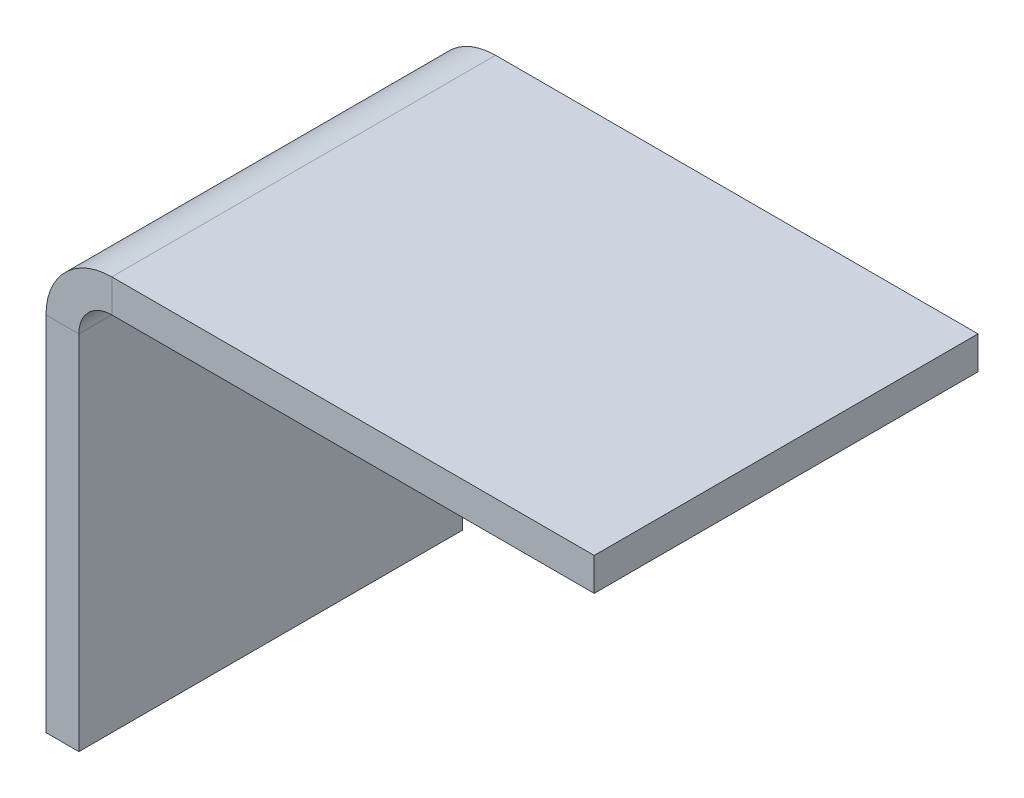
ISO-10303-21;
HEADER;
FILE_DESCRIPTION(('STEP AP214'),'2;1');
FILE_NAME('part.step','',(''),(''),'','','');
FILE_SCHEMA(('AUTOMOTIVE_DESIGN { 1 0 10303 214 1 1 1 1 }'));
ENDSEC;
DATA;
#1=APPLICATION_CONTEXT('core data for automotive mechanical design processes');
#2=APPLICATION_PROTOCOL_DEFINITION('international standard','automotive_design',2000,#1);
#3=PRODUCT_CONTEXT('',#1,'mechanical');
#4=PRODUCT('Part','Part','',(#3));
#5=PRODUCT_RELATED_PRODUCT_CATEGORY('part','',(#4));
#6=PRODUCT_DEFINITION_FORMATION('','',#4);
#7=PRODUCT_DEFINITION_CONTEXT('part definition',#1,'design');
#8=PRODUCT_DEFINITION('design','',#6,#7);
#9=PRODUCT_DEFINITION_SHAPE('','',#8);
#10=(LENGTH_UNIT() NAMED_UNIT(*) SI_UNIT(.MILLI.,.METRE.));
#11=(NAMED_UNIT(*) PLANE_ANGLE_UNIT() SI_UNIT($,.RADIAN.));
#12=(NAMED_UNIT(*) SI_UNIT($,.STERADIAN.) SOLID_ANGLE_UNIT());
#13=UNCERTAINTY_MEASURE_WITH_UNIT(LENGTH_MEASURE(1.E-05),#10,'distance_accuracy_value','');
#14=(GEOMETRIC_REPRESENTATION_CONTEXT(3) GLOBAL_UNCERTAINTY_ASSIGNED_CONTEXT((#13)) GLOBAL_UNIT_ASSIGNED_CONTEXT((#10,
#11,#12)) REPRESENTATION_CONTEXT('',''));
#15=CARTESIAN_POINT('',(0.,0.,0.));
#16=DIRECTION('',(0.,0.,1.));
#17=DIRECTION('',(1.,0.,0.));
#18=AXIS2_PLACEMENT_3D('',#15,#16,#17);
#19=CARTESIAN_POINT('',(-3.,342.335120643432,1731.23324396783));
#20=DIRECTION('',(0.,0.,1.));
#21=DIRECTION('',(1.,0.,0.));
#22=AXIS2_PLACEMENT_3D('',#19,#20,#21);
#23=PLANE('',#22);
#24=DIRECTION('',(0.,-1.,0.));
#25=VECTOR('',#24,1.);
#26=CARTESIAN_POINT('',(0.,342.335120643432,1731.23324396783));
#27=LINE('',#26,#25);
#28=CARTESIAN_POINT('',(0.,375.335120643432,1731.23324396783));
#29=VERTEX_POINT('',#28);
#30=CARTESIAN_POINT('',(0.,342.335120643432,1731.23324396783));
#31=VERTEX_POINT('',#30);
#32=EDGE_CURVE('E93',#29,#31,#27,.T.);
#33=ORIENTED_EDGE('',*,*,#32,.F.);
#34=DIRECTION('',(1.,0.,0.));
#35=VECTOR('',#34,1.);
#36=CARTESIAN_POINT('',(-3.,375.335120643432,1731.23324396783));
#37=LINE('',#36,#35);
#38=CARTESIAN_POINT('',(-2.99999999999999,375.335120643432,1731.23324396783));
#39=VERTEX_POINT('',#38);
#40=EDGE_CURVE('E13',#39,#29,#37,.T.);
#41=ORIENTED_EDGE('',*,*,#40,.F.);
#42=DIRECTION('',(0.,-1.,0.));
#43=VECTOR('',#42,1.);
#44=CARTESIAN_POINT('',(-3.,342.335120643432,1731.23324396783));
#45=LINE('',#44,#43);
#46=CARTESIAN_POINT('',(-3.,342.335120643432,1731.23324396783));
#47=VERTEX_POINT('',#46);
#48=EDGE_CURVE('E182',#39,#47,#45,.T.);
#49=ORIENTED_EDGE('',*,*,#48,.T.);
#50=DIRECTION('',(1.,0.,0.));
#51=VECTOR('',#50,1.);
#52=CARTESIAN_POINT('',(-3.,342.335120643432,1731.23324396783));
#53=LINE('',#52,#51);
#54=EDGE_CURVE('E58',#47,#31,#53,.T.);
#55=ORIENTED_EDGE('',*,*,#54,.T.);
#56=EDGE_LOOP('',(#33,#41,#49,#55));
#57=FACE_BOUND('',#56,.T.);
#58=ADVANCED_FACE('F55',(#57),#23,.T.);
#59=CARTESIAN_POINT('',(-3.,342.335120643432,1696.23324396783));
#60=DIRECTION('',(0.,0.,-1.));
#61=DIRECTION('',(-1.,0.,0.));
#62=AXIS2_PLACEMENT_3D('',#59,#60,#61);
#63=PLANE('',#62);
#64=DIRECTION('',(0.,1.,0.));
#65=VECTOR('',#64,1.);
#66=CARTESIAN_POINT('',(0.,342.335120643432,1696.23324396783));
#67=LINE('',#66,#65);
#68=CARTESIAN_POINT('',(0.,342.335120643432,1696.23324396783));
#69=VERTEX_POINT('',#68);
#70=CARTESIAN_POINT('',(0.,375.335120643432,1696.23324396783));
#71=VERTEX_POINT('',#70);
#72=EDGE_CURVE('E196',#69,#71,#67,.T.);
#73=ORIENTED_EDGE('',*,*,#72,.F.);
#74=DIRECTION('',(1.,0.,0.));
#75=VECTOR('',#74,1.);
#76=CARTESIAN_POINT('',(-3.,342.335120643432,1696.23324396783));
#77=LINE('',#76,#75);
#78=CARTESIAN_POINT('',(-3.,342.335120643432,1696.23324396783));
#79=VERTEX_POINT('',#78);
#80=EDGE_CURVE('E199',#79,#69,#77,.T.);
#81=ORIENTED_EDGE('',*,*,#80,.F.);
#82=DIRECTION('',(0.,1.,0.));
#83=VECTOR('',#82,1.);
#84=CARTESIAN_POINT('',(-3.,342.335120643432,1696.23324396783));
#85=LINE('',#84,#83);
#86=CARTESIAN_POINT('',(-3.,375.335120643432,1696.23324396783));
#87=VERTEX_POINT('',#86);
#88=EDGE_CURVE('E73',#79,#87,#85,.T.);
#89=ORIENTED_EDGE('',*,*,#88,.T.);
#90=DIRECTION('',(1.,0.,0.));
#91=VECTOR('',#90,1.);
#92=CARTESIAN_POINT('',(-3.,375.335120643432,1696.23324396783));
#93=LINE('',#92,#91);
#94=EDGE_CURVE('E64',#87,#71,#93,.T.);
#95=ORIENTED_EDGE('',*,*,#94,.T.);
#96=EDGE_LOOP('',(#73,#81,#89,#95));
#97=FACE_BOUND('',#96,.T.);
#98=ADVANCED_FACE('F234',(#97),#63,.T.);
#99=CARTESIAN_POINT('',(-3.,342.335120643432,1731.23324396783));
#100=DIRECTION('',(0.,-1.,0.));
#101=DIRECTION('',(0.,0.,-1.));
#102=AXIS2_PLACEMENT_3D('',#99,#100,#101);
#103=PLANE('',#102);
#104=DIRECTION('',(0.,0.,-1.));
#105=VECTOR('',#104,1.);
#106=CARTESIAN_POINT('',(0.,342.335120643432,1731.23324396783));
#107=LINE('',#106,#105);
#108=EDGE_CURVE('E193',#31,#69,#107,.T.);
#109=ORIENTED_EDGE('',*,*,#108,.F.);
#110=ORIENTED_EDGE('',*,*,#54,.F.);
#111=DIRECTION('',(0.,0.,-1.));
#112=VECTOR('',#111,1.);
#113=CARTESIAN_POINT('',(-3.,342.335120643432,1731.23324396783));
#114=LINE('',#113,#112);
#115=EDGE_CURVE('E185',#47,#79,#114,.T.);
#116=ORIENTED_EDGE('',*,*,#115,.T.);
#117=ORIENTED_EDGE('',*,*,#80,.T.);
#118=EDGE_LOOP('',(#109,#110,#116,#117));
#119=FACE_BOUND('',#118,.T.);
#120=ADVANCED_FACE('F200',(#119),#103,.T.);
#121=CARTESIAN_POINT('',(-3.,0.,0.));
#122=DIRECTION('',(-1.,0.,0.));
#123=DIRECTION('',(0.,0.,1.));
#124=AXIS2_PLACEMENT_3D('',#121,#122,#123);
#125=PLANE('',#124);
#126=ORIENTED_EDGE('',*,*,#48,.F.);
#127=DIRECTION('',(0.,0.,1.));
#128=VECTOR('',#127,1.);
#129=CARTESIAN_POINT('',(-3.,375.335120643432,1731.23324396783));
#130=LINE('',#129,#128);
#131=EDGE_CURVE('E189',#87,#39,#130,.T.);
#132=ORIENTED_EDGE('',*,*,#131,.F.);
#133=ORIENTED_EDGE('',*,*,#88,.F.);
#134=ORIENTED_EDGE('',*,*,#115,.F.);
#135=EDGE_LOOP('',(#126,#132,#133,#134));
#136=FACE_BOUND('',#135,.T.);
#137=ADVANCED_FACE('F230',(#136),#125,.T.);
#138=CARTESIAN_POINT('',(0.,0.,0.));
#139=DIRECTION('',(-1.,0.,0.));
#140=DIRECTION('',(0.,0.,1.));
#141=AXIS2_PLACEMENT_3D('',#138,#139,#140);
#142=PLANE('',#141);
#143=ORIENTED_EDGE('',*,*,#32,.T.);
#144=ORIENTED_EDGE('',*,*,#108,.T.);
#145=ORIENTED_EDGE('',*,*,#72,.T.);
#146=DIRECTION('',(0.,0.,1.));
#147=VECTOR('',#146,1.);
#148=CARTESIAN_POINT('',(0.,375.335120643432,1731.23324396783));
#149=LINE('',#148,#147);
#150=EDGE_CURVE('E186',#71,#29,#149,.T.);
#151=ORIENTED_EDGE('',*,*,#150,.T.);
#152=EDGE_LOOP('',(#143,#144,#145,#151));
#153=FACE_BOUND('',#152,.T.);
#154=ADVANCED_FACE('F202',(#153),#142,.F.);
#155=CARTESIAN_POINT('',(3.00000000000001,375.335120643432,1696.23324396783));
#156=DIRECTION('',(0.,0.,-1.));
#157=DIRECTION('',(-1.,0.,0.));
#158=AXIS2_PLACEMENT_3D('',#155,#156,#157);
#159=PLANE('',#158);
#160=DIRECTION('',(0.,-1.,0.));
#161=VECTOR('',#160,1.);
#162=CARTESIAN_POINT('',(2.99999999999999,381.335120643432,1696.23324396783));
#163=LINE('',#162,#161);
#164=CARTESIAN_POINT('',(3.,378.335120643432,1696.23324396783));
#165=VERTEX_POINT('',#164);
#166=CARTESIAN_POINT('',(2.99999999999999,381.335120643432,1696.23324396783));
#167=VERTEX_POINT('',#166);
#168=EDGE_CURVE('E153',#165,#167,#163,.F.);
#169=ORIENTED_EDGE('',*,*,#168,.F.);
#170=CARTESIAN_POINT('',(3.00000000000001,375.335120643432,1696.23324396783));
#171=DIRECTION('',(0.,0.,1.));
#172=DIRECTION('',(1.,0.,0.));
#173=AXIS2_PLACEMENT_3D('',#170,#171,#172);
#174=CIRCLE('',#173,3.);
#175=EDGE_CURVE('E176',#71,#165,#174,.F.);
#176=ORIENTED_EDGE('',*,*,#175,.F.);
#177=ORIENTED_EDGE('',*,*,#94,.F.);
#178=CARTESIAN_POINT('',(3.00000000000001,375.335120643432,1696.23324396783));
#179=DIRECTION('',(0.,0.,1.));
#180=DIRECTION('',(1.,0.,0.));
#181=AXIS2_PLACEMENT_3D('',#178,#179,#180);
#182=CIRCLE('',#181,6.);
#183=EDGE_CURVE('E170',#87,#167,#182,.F.);
#184=ORIENTED_EDGE('',*,*,#183,.T.);
#185=EDGE_LOOP('',(#169,#176,#177,#184));
#186=FACE_BOUND('',#185,.T.);
#187=ADVANCED_FACE('F222',(#186),#159,.T.);
#188=CARTESIAN_POINT('',(3.00000000000001,375.335120643432,1731.23324396783));
#189=DIRECTION('',(0.,0.,-1.));
#190=DIRECTION('',(-1.,0.,0.));
#191=AXIS2_PLACEMENT_3D('',#188,#189,#190);
#192=PLANE('',#191);
#193=CARTESIAN_POINT('',(3.00000000000001,375.335120643432,1731.23324396783));
#194=DIRECTION('',(0.,0.,1.));
#195=DIRECTION('',(1.,0.,0.));
#196=AXIS2_PLACEMENT_3D('',#193,#194,#195);
#197=CIRCLE('',#196,3.);
#198=CARTESIAN_POINT('',(3.,378.335120643432,1731.23324396783));
#199=VERTEX_POINT('',#198);
#200=EDGE_CURVE('E179',#199,#29,#197,.T.);
#201=ORIENTED_EDGE('',*,*,#200,.F.);
#202=DIRECTION('',(0.,-1.,0.));
#203=VECTOR('',#202,1.);
#204=CARTESIAN_POINT('',(3.,378.335120643432,1731.23324396783));
#205=LINE('',#204,#203);
#206=CARTESIAN_POINT('',(2.99999999999999,381.335120643432,1731.23324396783));
#207=VERTEX_POINT('',#206);
#208=EDGE_CURVE('E164',#199,#207,#205,.F.);
#209=ORIENTED_EDGE('',*,*,#208,.T.);
#210=CARTESIAN_POINT('',(3.00000000000001,375.335120643432,1731.23324396783));
#211=DIRECTION('',(0.,0.,1.));
#212=DIRECTION('',(1.,0.,0.));
#213=AXIS2_PLACEMENT_3D('',#210,#211,#212);
#214=CIRCLE('',#213,6.);
#215=EDGE_CURVE('E173',#207,#39,#214,.T.);
#216=ORIENTED_EDGE('',*,*,#215,.T.);
#217=ORIENTED_EDGE('',*,*,#40,.T.);
#218=EDGE_LOOP('',(#201,#209,#216,#217));
#219=FACE_BOUND('',#218,.T.);
#220=ADVANCED_FACE('F208',(#219),#192,.F.);
#221=CARTESIAN_POINT('',(3.00000000000001,375.335120643432,1731.23324396783));
#222=DIRECTION('',(0.,0.,1.));
#223=DIRECTION('',(0.,1.,0.));
#224=AXIS2_PLACEMENT_3D('',#221,#222,#223);
#225=CYLINDRICAL_SURFACE('',#224,6.);
#226=ORIENTED_EDGE('',*,*,#131,.T.);
#227=ORIENTED_EDGE('',*,*,#215,.F.);
#228=DIRECTION('',(0.,0.,1.));
#229=VECTOR('',#228,1.);
#230=CARTESIAN_POINT('',(2.99999999999999,381.335120643432,1696.23324396783));
#231=LINE('',#230,#229);
#232=EDGE_CURVE('E162',#207,#167,#231,.F.);
#233=ORIENTED_EDGE('',*,*,#232,.T.);
#234=ORIENTED_EDGE('',*,*,#183,.F.);
#235=EDGE_LOOP('',(#226,#227,#233,#234));
#236=FACE_BOUND('',#235,.T.);
#237=ADVANCED_FACE('F220',(#236),#225,.T.);
#238=CARTESIAN_POINT('',(3.00000000000001,375.335120643432,1731.23324396783));
#239=DIRECTION('',(0.,0.,1.));
#240=DIRECTION('',(0.,1.,0.));
#241=AXIS2_PLACEMENT_3D('',#238,#239,#240);
#242=CYLINDRICAL_SURFACE('',#241,3.);
#243=ORIENTED_EDGE('',*,*,#150,.F.);
#244=ORIENTED_EDGE('',*,*,#175,.T.);
#245=DIRECTION('',(0.,0.,1.));
#246=VECTOR('',#245,1.);
#247=CARTESIAN_POINT('',(3.,378.335120643432,1696.23324396783));
#248=LINE('',#247,#246);
#249=EDGE_CURVE('E167',#165,#199,#248,.T.);
#250=ORIENTED_EDGE('',*,*,#249,.T.);
#251=ORIENTED_EDGE('',*,*,#200,.T.);
#252=EDGE_LOOP('',(#243,#244,#250,#251));
#253=FACE_BOUND('',#252,.T.);
#254=ADVANCED_FACE('F210',(#253),#242,.F.);
#255=CARTESIAN_POINT('',(0.,381.335120643432,1696.23324396783));
#256=DIRECTION('',(0.,0.,1.));
#257=DIRECTION('',(1.,0.,0.));
#258=AXIS2_PLACEMENT_3D('',#255,#256,#257);
#259=PLANE('',#258);
#260=ORIENTED_EDGE('',*,*,#168,.T.);
#261=DIRECTION('',(-1.,0.,0.));
#262=VECTOR('',#261,1.);
#263=CARTESIAN_POINT('',(-1.34038622983184E-12,381.335120643432,1696.23324396783));
#264=LINE('',#263,#262);
#265=CARTESIAN_POINT('',(47.,381.335120643432,1696.23324396783));
#266=VERTEX_POINT('',#265);
#267=EDGE_CURVE('E134',#266,#167,#264,.T.);
#268=ORIENTED_EDGE('',*,*,#267,.F.);
#269=DIRECTION('',(0.,-1.,0.));
#270=VECTOR('',#269,1.);
#271=CARTESIAN_POINT('',(47.,381.335120643432,1696.23324396783));
#272=LINE('',#271,#270);
#273=CARTESIAN_POINT('',(47.,378.335120643432,1696.23324396783));
#274=VERTEX_POINT('',#273);
#275=EDGE_CURVE('E140',#266,#274,#272,.T.);
#276=ORIENTED_EDGE('',*,*,#275,.T.);
#277=DIRECTION('',(1.,0.,0.));
#278=VECTOR('',#277,1.);
#279=CARTESIAN_POINT('',(0.,378.335120643432,1696.23324396783));
#280=LINE('',#279,#278);
#281=EDGE_CURVE('E160',#274,#165,#280,.F.);
#282=ORIENTED_EDGE('',*,*,#281,.T.);
#283=EDGE_LOOP('',(#260,#268,#276,#282));
#284=FACE_BOUND('',#283,.T.);
#285=ADVANCED_FACE('F152',(#284),#259,.F.);
#286=CARTESIAN_POINT('',(47.,381.335120643432,1731.23324396783));
#287=DIRECTION('',(0.,0.,-1.));
#288=DIRECTION('',(-1.,0.,0.));
#289=AXIS2_PLACEMENT_3D('',#286,#287,#288);
#290=PLANE('',#289);
#291=ORIENTED_EDGE('',*,*,#208,.F.);
#292=DIRECTION('',(-1.,0.,0.));
#293=VECTOR('',#292,1.);
#294=CARTESIAN_POINT('',(47.,378.335120643432,1731.23324396783));
#295=LINE('',#294,#293);
#296=CARTESIAN_POINT('',(47.,378.335120643432,1731.23324396783));
#297=VERTEX_POINT('',#296);
#298=EDGE_CURVE('E156',#199,#297,#295,.F.);
#299=ORIENTED_EDGE('',*,*,#298,.T.);
#300=DIRECTION('',(0.,-1.,0.));
#301=VECTOR('',#300,1.);
#302=CARTESIAN_POINT('',(47.,381.335120643432,1731.23324396783));
#303=LINE('',#302,#301);
#304=CARTESIAN_POINT('',(47.,381.335120643432,1731.23324396783));
#305=VERTEX_POINT('',#304);
#306=EDGE_CURVE('E149',#305,#297,#303,.T.);
#307=ORIENTED_EDGE('',*,*,#306,.F.);
#308=DIRECTION('',(1.,0.,0.));
#309=VECTOR('',#308,1.);
#310=CARTESIAN_POINT('',(-1.34038622983184E-12,381.335120643432,1731.23324396783));
#311=LINE('',#310,#309);
#312=EDGE_CURVE('E136',#207,#305,#311,.T.);
#313=ORIENTED_EDGE('',*,*,#312,.F.);
#314=EDGE_LOOP('',(#291,#299,#307,#313));
#315=FACE_BOUND('',#314,.T.);
#316=ADVANCED_FACE('F216',(#315),#290,.F.);
#317=CARTESIAN_POINT('',(-1.34038622983184E-12,381.335120643432,0.));
#318=DIRECTION('',(0.,-1.,0.));
#319=DIRECTION('',(1.,0.,0.));
#320=AXIS2_PLACEMENT_3D('',#317,#318,#319);
#321=PLANE('',#320);
#322=ORIENTED_EDGE('',*,*,#232,.F.);
#323=ORIENTED_EDGE('',*,*,#312,.T.);
#324=DIRECTION('',(0.,0.,-1.));
#325=VECTOR('',#324,1.);
#326=CARTESIAN_POINT('',(47.,381.335120643432,0.));
#327=LINE('',#326,#325);
#328=EDGE_CURVE('E129',#305,#266,#327,.T.);
#329=ORIENTED_EDGE('',*,*,#328,.T.);
#330=ORIENTED_EDGE('',*,*,#267,.T.);
#331=EDGE_LOOP('',(#322,#323,#329,#330));
#332=FACE_BOUND('',#331,.T.);
#333=ADVANCED_FACE('F132',(#332),#321,.F.);
#334=CARTESIAN_POINT('',(-1.32991178581532E-12,378.335120643432,0.));
#335=DIRECTION('',(0.,-1.,0.));
#336=DIRECTION('',(1.,0.,0.));
#337=AXIS2_PLACEMENT_3D('',#334,#335,#336);
#338=PLANE('',#337);
#339=ORIENTED_EDGE('',*,*,#298,.F.);
#340=ORIENTED_EDGE('',*,*,#249,.F.);
#341=ORIENTED_EDGE('',*,*,#281,.F.);
#342=DIRECTION('',(0.,0.,1.));
#343=VECTOR('',#342,1.);
#344=CARTESIAN_POINT('',(47.,378.335120643432,1696.23324396783));
#345=LINE('',#344,#343);
#346=EDGE_CURVE('E145',#297,#274,#345,.F.);
#347=ORIENTED_EDGE('',*,*,#346,.F.);
#348=EDGE_LOOP('',(#339,#340,#341,#347));
#349=FACE_BOUND('',#348,.T.);
#350=ADVANCED_FACE('F214',(#349),#338,.T.);
#351=CARTESIAN_POINT('',(47.,381.335120643432,1696.23324396783));
#352=DIRECTION('',(-1.,0.,0.));
#353=DIRECTION('',(0.,-1.,0.));
#354=AXIS2_PLACEMENT_3D('',#351,#352,#353);
#355=PLANE('',#354);
#356=ORIENTED_EDGE('',*,*,#346,.T.);
#357=ORIENTED_EDGE('',*,*,#275,.F.);
#358=ORIENTED_EDGE('',*,*,#328,.F.);
#359=ORIENTED_EDGE('',*,*,#306,.T.);
#360=EDGE_LOOP('',(#356,#357,#358,#359));
#361=FACE_BOUND('',#360,.T.);
#362=ADVANCED_FACE('F143',(#361),#355,.F.);
#363=CLOSED_SHELL('',(#58,#98,#120,#137,#154,#187,#220,#237,#254,#285,#316,#333,#350,#362));
#364=MANIFOLD_SOLID_BREP('B2',#363);
#365=ADVANCED_BREP_SHAPE_REPRESENTATION('',(#18,#364),#14);
#366=SHAPE_DEFINITION_REPRESENTATION(#9,#365);
ENDSEC;
END-ISO-10303-21;
